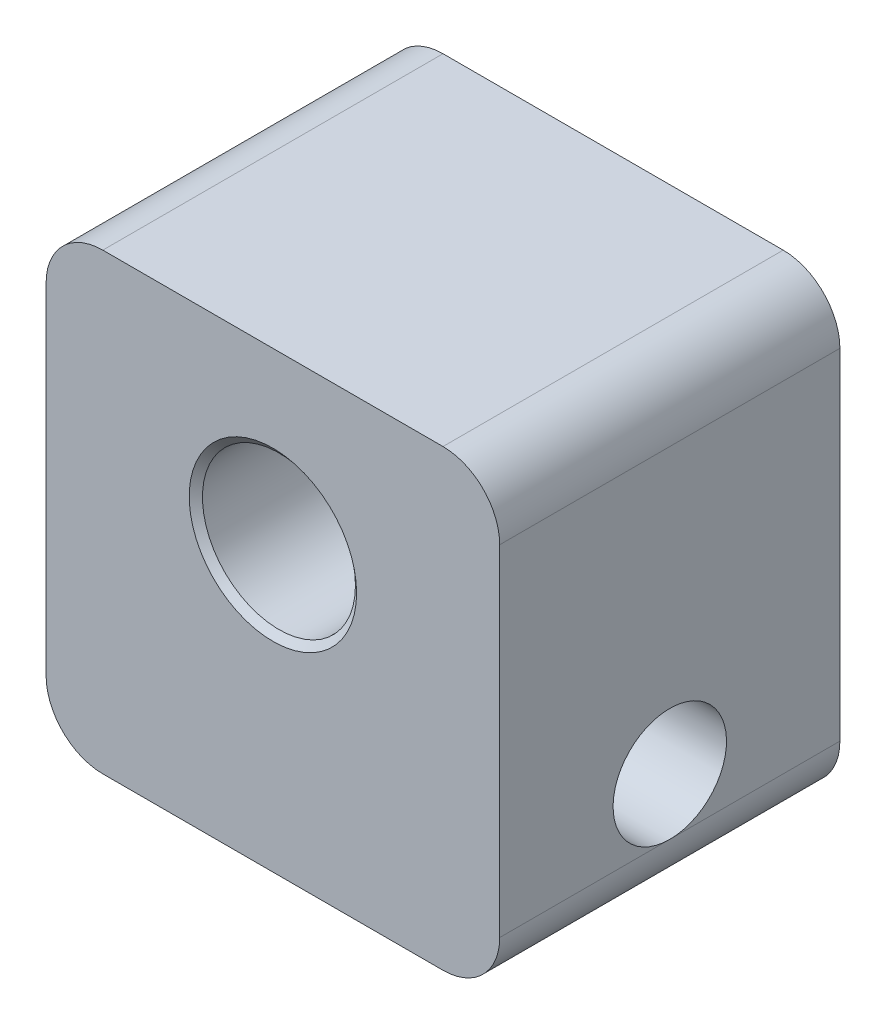
ISO-10303-21;
HEADER;
FILE_DESCRIPTION(('STEP AP214'),'2;1');
FILE_NAME('part.step','',(''),(''),'','','');
FILE_SCHEMA(('AUTOMOTIVE_DESIGN { 1 0 10303 214 1 1 1 1 }'));
ENDSEC;
DATA;
#1=APPLICATION_CONTEXT('core data for automotive mechanical design processes');
#2=APPLICATION_PROTOCOL_DEFINITION('international standard','automotive_design',2000,#1);
#3=PRODUCT_CONTEXT('',#1,'mechanical');
#4=PRODUCT('Part','Part','',(#3));
#5=PRODUCT_RELATED_PRODUCT_CATEGORY('part','',(#4));
#6=PRODUCT_DEFINITION_FORMATION('','',#4);
#7=PRODUCT_DEFINITION_CONTEXT('part definition',#1,'design');
#8=PRODUCT_DEFINITION('design','',#6,#7);
#9=PRODUCT_DEFINITION_SHAPE('','',#8);
#10=(LENGTH_UNIT() NAMED_UNIT(*) SI_UNIT(.MILLI.,.METRE.));
#11=(NAMED_UNIT(*) PLANE_ANGLE_UNIT() SI_UNIT($,.RADIAN.));
#12=(NAMED_UNIT(*) SI_UNIT($,.STERADIAN.) SOLID_ANGLE_UNIT());
#13=UNCERTAINTY_MEASURE_WITH_UNIT(LENGTH_MEASURE(1.E-05),#10,'distance_accuracy_value','');
#14=(GEOMETRIC_REPRESENTATION_CONTEXT(3) GLOBAL_UNCERTAINTY_ASSIGNED_CONTEXT((#13)) GLOBAL_UNIT_ASSIGNED_CONTEXT((#10,
#11,#12)) REPRESENTATION_CONTEXT('',''));
#15=CARTESIAN_POINT('',(0.,0.,0.));
#16=DIRECTION('',(0.,0.,1.));
#17=DIRECTION('',(1.,0.,0.));
#18=AXIS2_PLACEMENT_3D('',#15,#16,#17);
#19=CARTESIAN_POINT('',(20.,40.,-15.));
#20=DIRECTION('',(-1.,0.,0.));
#21=DIRECTION('',(0.,0.,1.));
#22=AXIS2_PLACEMENT_3D('',#19,#20,#21);
#23=PLANE('',#22);
#24=DIRECTION('',(0.,-1.,0.));
#25=VECTOR('',#24,1.);
#26=CARTESIAN_POINT('',(20.,40.,15.));
#27=LINE('',#26,#25);
#28=CARTESIAN_POINT('',(20.,35.,15.));
#29=VERTEX_POINT('',#28);
#30=CARTESIAN_POINT('',(20.,5.,15.));
#31=VERTEX_POINT('',#30);
#32=EDGE_CURVE('E134',#29,#31,#27,.T.);
#33=ORIENTED_EDGE('',*,*,#32,.T.);
#34=DIRECTION('',(0.,0.,-1.));
#35=VECTOR('',#34,1.);
#36=CARTESIAN_POINT('',(20.,5.,-15.));
#37=LINE('',#36,#35);
#38=CARTESIAN_POINT('',(20.,5.,0.));
#39=VERTEX_POINT('',#38);
#40=EDGE_CURVE('E120',#31,#39,#37,.T.);
#41=ORIENTED_EDGE('',*,*,#40,.T.);
#42=CARTESIAN_POINT('',(20.,10.,0.));
#43=DIRECTION('',(1.,0.,0.));
#44=DIRECTION('',(0.,0.,-1.));
#45=AXIS2_PLACEMENT_3D('',#42,#43,#44);
#46=CIRCLE('',#45,5.);
#47=EDGE_CURVE('E132',#39,#39,#46,.T.);
#48=ORIENTED_EDGE('',*,*,#47,.F.);
#49=DIRECTION('',(0.,0.,-1.));
#50=VECTOR('',#49,1.);
#51=CARTESIAN_POINT('',(20.,5.,-15.));
#52=LINE('',#51,#50);
#53=CARTESIAN_POINT('',(20.,5.,-15.));
#54=VERTEX_POINT('',#53);
#55=EDGE_CURVE('E116',#39,#54,#52,.T.);
#56=ORIENTED_EDGE('',*,*,#55,.T.);
#57=DIRECTION('',(0.,-1.,0.));
#58=VECTOR('',#57,1.);
#59=CARTESIAN_POINT('',(20.,40.,-15.));
#60=LINE('',#59,#58);
#61=CARTESIAN_POINT('',(20.,35.,-15.));
#62=VERTEX_POINT('',#61);
#63=EDGE_CURVE('E181',#62,#54,#60,.T.);
#64=ORIENTED_EDGE('',*,*,#63,.F.);
#65=DIRECTION('',(0.,0.,-1.));
#66=VECTOR('',#65,1.);
#67=CARTESIAN_POINT('',(20.,35.,15.));
#68=LINE('',#67,#66);
#69=EDGE_CURVE('E128',#62,#29,#68,.F.);
#70=ORIENTED_EDGE('',*,*,#69,.T.);
#71=EDGE_LOOP('',(#33,#41,#48,#56,#64,#70));
#72=FACE_BOUND('',#71,.T.);
#73=ADVANCED_FACE('F43',(#72),#23,.F.);
#74=CARTESIAN_POINT('',(-20.,40.,-15.));
#75=DIRECTION('',(0.,0.,1.));
#76=DIRECTION('',(1.,0.,0.));
#77=AXIS2_PLACEMENT_3D('',#74,#75,#76);
#78=PLANE('',#77);
#79=CARTESIAN_POINT('',(0.,25.,-15.));
#80=DIRECTION('',(0.,0.,1.));
#81=DIRECTION('',(1.,0.,0.));
#82=AXIS2_PLACEMENT_3D('',#79,#80,#81);
#83=CIRCLE('',#82,11.74624);
#84=CARTESIAN_POINT('',(11.74624,25.,-15.));
#85=VERTEX_POINT('',#84);
#86=EDGE_CURVE('E136',#85,#85,#83,.T.);
#87=ORIENTED_EDGE('',*,*,#86,.T.);
#88=EDGE_LOOP('',(#87));
#89=FACE_BOUND('',#88,.T.);
#90=ORIENTED_EDGE('',*,*,#63,.T.);
#91=CARTESIAN_POINT('',(15.,5.,-15.));
#92=DIRECTION('',(0.,0.,1.));
#93=DIRECTION('',(1.,0.,0.));
#94=AXIS2_PLACEMENT_3D('',#91,#92,#93);
#95=CIRCLE('',#94,5.);
#96=CARTESIAN_POINT('',(15.,0.,-15.));
#97=VERTEX_POINT('',#96);
#98=EDGE_CURVE('E122',#54,#97,#95,.F.);
#99=ORIENTED_EDGE('',*,*,#98,.T.);
#100=DIRECTION('',(-1.,0.,0.));
#101=VECTOR('',#100,1.);
#102=CARTESIAN_POINT('',(-20.,0.,-15.));
#103=LINE('',#102,#101);
#104=CARTESIAN_POINT('',(-15.,0.,-15.));
#105=VERTEX_POINT('',#104);
#106=EDGE_CURVE('E156',#97,#105,#103,.T.);
#107=ORIENTED_EDGE('',*,*,#106,.T.);
#108=CARTESIAN_POINT('',(-15.,5.,-15.));
#109=DIRECTION('',(0.,0.,1.));
#110=DIRECTION('',(1.,0.,0.));
#111=AXIS2_PLACEMENT_3D('',#108,#109,#110);
#112=CIRCLE('',#111,5.);
#113=CARTESIAN_POINT('',(-20.,5.,-15.));
#114=VERTEX_POINT('',#113);
#115=EDGE_CURVE('E195',#105,#114,#112,.F.);
#116=ORIENTED_EDGE('',*,*,#115,.T.);
#117=DIRECTION('',(0.,-1.,0.));
#118=VECTOR('',#117,1.);
#119=CARTESIAN_POINT('',(-20.,40.,-15.));
#120=LINE('',#119,#118);
#121=CARTESIAN_POINT('',(-20.,35.,-15.));
#122=VERTEX_POINT('',#121);
#123=EDGE_CURVE('E177',#122,#114,#120,.T.);
#124=ORIENTED_EDGE('',*,*,#123,.F.);
#125=CARTESIAN_POINT('',(-15.,35.,-15.));
#126=DIRECTION('',(0.,0.,1.));
#127=DIRECTION('',(1.,0.,0.));
#128=AXIS2_PLACEMENT_3D('',#125,#126,#127);
#129=CIRCLE('',#128,5.);
#130=CARTESIAN_POINT('',(-15.,40.,-15.));
#131=VERTEX_POINT('',#130);
#132=EDGE_CURVE('E192',#122,#131,#129,.F.);
#133=ORIENTED_EDGE('',*,*,#132,.T.);
#134=DIRECTION('',(-1.,0.,0.));
#135=VECTOR('',#134,1.);
#136=CARTESIAN_POINT('',(-20.,40.,-15.));
#137=LINE('',#136,#135);
#138=CARTESIAN_POINT('',(15.,40.,-15.));
#139=VERTEX_POINT('',#138);
#140=EDGE_CURVE('E157',#139,#131,#137,.T.);
#141=ORIENTED_EDGE('',*,*,#140,.F.);
#142=CARTESIAN_POINT('',(15.,35.,-15.));
#143=DIRECTION('',(0.,0.,1.));
#144=DIRECTION('',(1.,0.,0.));
#145=AXIS2_PLACEMENT_3D('',#142,#143,#144);
#146=CIRCLE('',#145,5.);
#147=EDGE_CURVE('E189',#139,#62,#146,.F.);
#148=ORIENTED_EDGE('',*,*,#147,.T.);
#149=EDGE_LOOP('',(#90,#99,#107,#116,#124,#133,#141,#148));
#150=FACE_BOUND('',#149,.T.);
#151=ADVANCED_FACE('F246',(#89,#150),#78,.F.);
#152=CARTESIAN_POINT('',(-20.,40.,-15.));
#153=DIRECTION('',(1.,0.,0.));
#154=DIRECTION('',(0.,0.,-1.));
#155=AXIS2_PLACEMENT_3D('',#152,#153,#154);
#156=PLANE('',#155);
#157=ORIENTED_EDGE('',*,*,#123,.T.);
#158=DIRECTION('',(0.,0.,1.));
#159=VECTOR('',#158,1.);
#160=CARTESIAN_POINT('',(-20.,5.,-15.));
#161=LINE('',#160,#159);
#162=CARTESIAN_POINT('',(-20.,5.,0.));
#163=VERTEX_POINT('',#162);
#164=EDGE_CURVE('E223',#114,#163,#161,.T.);
#165=ORIENTED_EDGE('',*,*,#164,.T.);
#166=CARTESIAN_POINT('',(-20.,10.,0.));
#167=DIRECTION('',(1.,0.,0.));
#168=DIRECTION('',(0.,0.,-1.));
#169=AXIS2_PLACEMENT_3D('',#166,#167,#168);
#170=CIRCLE('',#169,5.);
#171=EDGE_CURVE('E142',#163,#163,#170,.F.);
#172=ORIENTED_EDGE('',*,*,#171,.F.);
#173=DIRECTION('',(0.,0.,1.));
#174=VECTOR('',#173,1.);
#175=CARTESIAN_POINT('',(-20.,5.,-15.));
#176=LINE('',#175,#174);
#177=CARTESIAN_POINT('',(-20.,5.,15.));
#178=VERTEX_POINT('',#177);
#179=EDGE_CURVE('E59',#163,#178,#176,.T.);
#180=ORIENTED_EDGE('',*,*,#179,.T.);
#181=DIRECTION('',(0.,-1.,0.));
#182=VECTOR('',#181,1.);
#183=CARTESIAN_POINT('',(-20.,40.,15.));
#184=LINE('',#183,#182);
#185=CARTESIAN_POINT('',(-20.,35.,15.));
#186=VERTEX_POINT('',#185);
#187=EDGE_CURVE('E174',#186,#178,#184,.T.);
#188=ORIENTED_EDGE('',*,*,#187,.F.);
#189=DIRECTION('',(0.,0.,1.));
#190=VECTOR('',#189,1.);
#191=CARTESIAN_POINT('',(-20.,35.,-15.));
#192=LINE('',#191,#190);
#193=EDGE_CURVE('E218',#186,#122,#192,.F.);
#194=ORIENTED_EDGE('',*,*,#193,.T.);
#195=EDGE_LOOP('',(#157,#165,#172,#180,#188,#194));
#196=FACE_BOUND('',#195,.T.);
#197=ADVANCED_FACE('F250',(#196),#156,.F.);
#198=CARTESIAN_POINT('',(-20.,40.,15.));
#199=DIRECTION('',(0.,0.,-1.));
#200=DIRECTION('',(-1.,0.,0.));
#201=AXIS2_PLACEMENT_3D('',#198,#199,#200);
#202=PLANE('',#201);
#203=CARTESIAN_POINT('',(0.,25.,15.));
#204=DIRECTION('',(0.,0.,1.));
#205=DIRECTION('',(1.,0.,0.));
#206=AXIS2_PLACEMENT_3D('',#203,#204,#205);
#207=CIRCLE('',#206,7.38124);
#208=CARTESIAN_POINT('',(7.38124,25.,15.));
#209=VERTEX_POINT('',#208);
#210=EDGE_CURVE('E146',#209,#209,#207,.T.);
#211=ORIENTED_EDGE('',*,*,#210,.F.);
#212=EDGE_LOOP('',(#211));
#213=FACE_BOUND('',#212,.T.);
#214=DIRECTION('',(1.,0.,0.));
#215=VECTOR('',#214,1.);
#216=CARTESIAN_POINT('',(-20.,0.,15.));
#217=LINE('',#216,#215);
#218=CARTESIAN_POINT('',(-15.,0.,15.));
#219=VERTEX_POINT('',#218);
#220=CARTESIAN_POINT('',(15.,0.,15.));
#221=VERTEX_POINT('',#220);
#222=EDGE_CURVE('E162',#219,#221,#217,.T.);
#223=ORIENTED_EDGE('',*,*,#222,.T.);
#224=CARTESIAN_POINT('',(15.,5.,15.));
#225=DIRECTION('',(0.,0.,-1.));
#226=DIRECTION('',(-1.,0.,0.));
#227=AXIS2_PLACEMENT_3D('',#224,#225,#226);
#228=CIRCLE('',#227,5.);
#229=EDGE_CURVE('E215',#221,#31,#228,.F.);
#230=ORIENTED_EDGE('',*,*,#229,.T.);
#231=ORIENTED_EDGE('',*,*,#32,.F.);
#232=CARTESIAN_POINT('',(15.,35.,15.));
#233=DIRECTION('',(0.,0.,-1.));
#234=DIRECTION('',(-1.,0.,0.));
#235=AXIS2_PLACEMENT_3D('',#232,#233,#234);
#236=CIRCLE('',#235,5.);
#237=CARTESIAN_POINT('',(15.,40.,15.));
#238=VERTEX_POINT('',#237);
#239=EDGE_CURVE('E206',#29,#238,#236,.F.);
#240=ORIENTED_EDGE('',*,*,#239,.T.);
#241=DIRECTION('',(1.,0.,0.));
#242=VECTOR('',#241,1.);
#243=CARTESIAN_POINT('',(-20.,40.,15.));
#244=LINE('',#243,#242);
#245=CARTESIAN_POINT('',(-15.,40.,15.));
#246=VERTEX_POINT('',#245);
#247=EDGE_CURVE('E161',#246,#238,#244,.T.);
#248=ORIENTED_EDGE('',*,*,#247,.F.);
#249=CARTESIAN_POINT('',(-15.,35.,15.));
#250=DIRECTION('',(0.,0.,-1.));
#251=DIRECTION('',(-1.,0.,0.));
#252=AXIS2_PLACEMENT_3D('',#249,#250,#251);
#253=CIRCLE('',#252,5.);
#254=EDGE_CURVE('E209',#246,#186,#253,.F.);
#255=ORIENTED_EDGE('',*,*,#254,.T.);
#256=ORIENTED_EDGE('',*,*,#187,.T.);
#257=CARTESIAN_POINT('',(-15.,5.,15.));
#258=DIRECTION('',(0.,0.,-1.));
#259=DIRECTION('',(-1.,0.,0.));
#260=AXIS2_PLACEMENT_3D('',#257,#258,#259);
#261=CIRCLE('',#260,5.);
#262=EDGE_CURVE('E212',#178,#219,#261,.F.);
#263=ORIENTED_EDGE('',*,*,#262,.T.);
#264=EDGE_LOOP('',(#223,#230,#231,#240,#248,#255,#256,#263));
#265=FACE_BOUND('',#264,.T.);
#266=ADVANCED_FACE('F240',(#213,#265),#202,.F.);
#267=CARTESIAN_POINT('',(0.,40.,0.));
#268=DIRECTION('',(0.,1.,0.));
#269=DIRECTION('',(0.,0.,1.));
#270=AXIS2_PLACEMENT_3D('',#267,#268,#269);
#271=PLANE('',#270);
#272=ORIENTED_EDGE('',*,*,#140,.T.);
#273=DIRECTION('',(0.,0.,1.));
#274=VECTOR('',#273,1.);
#275=CARTESIAN_POINT('',(-15.,40.,15.));
#276=LINE('',#275,#274);
#277=EDGE_CURVE('E52',#131,#246,#276,.T.);
#278=ORIENTED_EDGE('',*,*,#277,.T.);
#279=ORIENTED_EDGE('',*,*,#247,.T.);
#280=DIRECTION('',(0.,0.,-1.));
#281=VECTOR('',#280,1.);
#282=CARTESIAN_POINT('',(15.,40.,-15.));
#283=LINE('',#282,#281);
#284=EDGE_CURVE('E226',#238,#139,#283,.T.);
#285=ORIENTED_EDGE('',*,*,#284,.T.);
#286=EDGE_LOOP('',(#272,#278,#279,#285));
#287=FACE_BOUND('',#286,.T.);
#288=ADVANCED_FACE('F234',(#287),#271,.T.);
#289=CARTESIAN_POINT('',(0.,0.,0.));
#290=DIRECTION('',(0.,1.,0.));
#291=DIRECTION('',(0.,0.,1.));
#292=AXIS2_PLACEMENT_3D('',#289,#290,#291);
#293=PLANE('',#292);
#294=ORIENTED_EDGE('',*,*,#106,.F.);
#295=DIRECTION('',(0.,0.,-1.));
#296=VECTOR('',#295,1.);
#297=CARTESIAN_POINT('',(15.,0.,0.));
#298=LINE('',#297,#296);
#299=EDGE_CURVE('E203',#97,#221,#298,.F.);
#300=ORIENTED_EDGE('',*,*,#299,.T.);
#301=ORIENTED_EDGE('',*,*,#222,.F.);
#302=DIRECTION('',(0.,0.,1.));
#303=VECTOR('',#302,1.);
#304=CARTESIAN_POINT('',(-15.,0.,0.));
#305=LINE('',#304,#303);
#306=EDGE_CURVE('E200',#219,#105,#305,.F.);
#307=ORIENTED_EDGE('',*,*,#306,.T.);
#308=EDGE_LOOP('',(#294,#300,#301,#307));
#309=FACE_BOUND('',#308,.T.);
#310=ADVANCED_FACE('F257',(#309),#293,.F.);
#311=CARTESIAN_POINT('',(0.,25.,15.));
#312=DIRECTION('',(0.,0.,1.));
#313=DIRECTION('',(1.,0.,0.));
#314=AXIS2_PLACEMENT_3D('',#311,#312,#313);
#315=CYLINDRICAL_SURFACE('',#314,6.74624);
#316=CARTESIAN_POINT('',(0.,25.,-10.));
#317=DIRECTION('',(0.,0.,1.));
#318=DIRECTION('',(1.,0.,0.));
#319=AXIS2_PLACEMENT_3D('',#316,#317,#318);
#320=CIRCLE('',#319,6.74624);
#321=CARTESIAN_POINT('',(6.74624,25.,-10.));
#322=VERTEX_POINT('',#321);
#323=EDGE_CURVE('E11',#322,#322,#320,.F.);
#324=ORIENTED_EDGE('',*,*,#323,.T.);
#325=EDGE_LOOP('',(#324));
#326=FACE_BOUND('',#325,.T.);
#327=CARTESIAN_POINT('',(0.,25.,14.4671717342024));
#328=DIRECTION('',(0.,0.,1.));
#329=DIRECTION('',(1.,0.,0.));
#330=AXIS2_PLACEMENT_3D('',#327,#328,#329);
#331=CIRCLE('',#330,6.74624);
#332=CARTESIAN_POINT('',(6.74624,25.,14.4671717342024));
#333=VERTEX_POINT('',#332);
#334=EDGE_CURVE('E152',#333,#333,#331,.T.);
#335=ORIENTED_EDGE('',*,*,#334,.T.);
#336=EDGE_LOOP('',(#335));
#337=FACE_BOUND('',#336,.T.);
#338=ADVANCED_FACE('F259',(#326,#337),#315,.F.);
#339=CARTESIAN_POINT('',(0.,25.,15.));
#340=DIRECTION('',(0.,0.,1.));
#341=DIRECTION('',(1.,0.,0.));
#342=AXIS2_PLACEMENT_3D('',#339,#340,#341);
#343=CONICAL_SURFACE('',#342,7.38124,0.87266462599716);
#344=ORIENTED_EDGE('',*,*,#334,.F.);
#345=EDGE_LOOP('',(#344));
#346=FACE_BOUND('',#345,.T.);
#347=ORIENTED_EDGE('',*,*,#210,.T.);
#348=EDGE_LOOP('',(#347));
#349=FACE_BOUND('',#348,.T.);
#350=ADVANCED_FACE('F265',(#346,#349),#343,.F.);
#351=CARTESIAN_POINT('',(-20.001,10.,0.));
#352=DIRECTION('',(1.,0.,0.));
#353=DIRECTION('',(0.,0.,-1.));
#354=AXIS2_PLACEMENT_3D('',#351,#352,#353);
#355=CYLINDRICAL_SURFACE('',#354,5.);
#356=ORIENTED_EDGE('',*,*,#47,.T.);
#357=EDGE_LOOP('',(#356));
#358=FACE_BOUND('',#357,.T.);
#359=ORIENTED_EDGE('',*,*,#171,.T.);
#360=EDGE_LOOP('',(#359));
#361=FACE_BOUND('',#360,.T.);
#362=ADVANCED_FACE('F139',(#358,#361),#355,.F.);
#363=CARTESIAN_POINT('',(15.,5.,-15.));
#364=DIRECTION('',(0.,0.,-1.));
#365=DIRECTION('',(-1.,0.,0.));
#366=AXIS2_PLACEMENT_3D('',#363,#364,#365);
#367=CYLINDRICAL_SURFACE('',#366,5.);
#368=ORIENTED_EDGE('',*,*,#229,.F.);
#369=ORIENTED_EDGE('',*,*,#299,.F.);
#370=ORIENTED_EDGE('',*,*,#98,.F.);
#371=ORIENTED_EDGE('',*,*,#55,.F.);
#372=ORIENTED_EDGE('',*,*,#40,.F.);
#373=EDGE_LOOP('',(#368,#369,#370,#371,#372));
#374=FACE_BOUND('',#373,.T.);
#375=ADVANCED_FACE('F119',(#374),#367,.T.);
#376=CARTESIAN_POINT('',(-15.,5.,-15.));
#377=DIRECTION('',(0.,0.,1.));
#378=DIRECTION('',(1.,0.,0.));
#379=AXIS2_PLACEMENT_3D('',#376,#377,#378);
#380=CYLINDRICAL_SURFACE('',#379,5.);
#381=ORIENTED_EDGE('',*,*,#115,.F.);
#382=ORIENTED_EDGE('',*,*,#306,.F.);
#383=ORIENTED_EDGE('',*,*,#262,.F.);
#384=ORIENTED_EDGE('',*,*,#179,.F.);
#385=ORIENTED_EDGE('',*,*,#164,.F.);
#386=EDGE_LOOP('',(#381,#382,#383,#384,#385));
#387=FACE_BOUND('',#386,.T.);
#388=ADVANCED_FACE('F254',(#387),#380,.T.);
#389=CARTESIAN_POINT('',(-15.,35.,0.));
#390=DIRECTION('',(0.,0.,-1.));
#391=DIRECTION('',(-1.,0.,0.));
#392=AXIS2_PLACEMENT_3D('',#389,#390,#391);
#393=CYLINDRICAL_SURFACE('',#392,5.);
#394=ORIENTED_EDGE('',*,*,#132,.F.);
#395=ORIENTED_EDGE('',*,*,#193,.F.);
#396=ORIENTED_EDGE('',*,*,#254,.F.);
#397=ORIENTED_EDGE('',*,*,#277,.F.);
#398=EDGE_LOOP('',(#394,#395,#396,#397));
#399=FACE_BOUND('',#398,.T.);
#400=ADVANCED_FACE('F249',(#399),#393,.T.);
#401=CARTESIAN_POINT('',(15.,35.,0.));
#402=DIRECTION('',(0.,0.,1.));
#403=DIRECTION('',(1.,0.,0.));
#404=AXIS2_PLACEMENT_3D('',#401,#402,#403);
#405=CYLINDRICAL_SURFACE('',#404,5.);
#406=ORIENTED_EDGE('',*,*,#239,.F.);
#407=ORIENTED_EDGE('',*,*,#69,.F.);
#408=ORIENTED_EDGE('',*,*,#147,.F.);
#409=ORIENTED_EDGE('',*,*,#284,.F.);
#410=EDGE_LOOP('',(#406,#407,#408,#409));
#411=FACE_BOUND('',#410,.T.);
#412=ADVANCED_FACE('F244',(#411),#405,.T.);
#413=CARTESIAN_POINT('',(0.,25.,-10.));
#414=DIRECTION('',(0.,0.,1.));
#415=DIRECTION('',(1.,0.,0.));
#416=AXIS2_PLACEMENT_3D('',#413,#414,#415);
#417=TOROIDAL_SURFACE('',#416,11.74624,5.);
#418=ORIENTED_EDGE('',*,*,#323,.F.);
#419=EDGE_LOOP('',(#418));
#420=FACE_BOUND('',#419,.T.);
#421=ORIENTED_EDGE('',*,*,#86,.F.);
#422=EDGE_LOOP('',(#421));
#423=FACE_BOUND('',#422,.T.);
#424=ADVANCED_FACE('F45',(#420,#423),#417,.T.);
#425=CLOSED_SHELL('',(#73,#151,#197,#266,#288,#310,#338,#350,#362,#375,#388,#400,#412,#424));
#426=MANIFOLD_SOLID_BREP('B2',#425);
#427=ADVANCED_BREP_SHAPE_REPRESENTATION('',(#18,#426),#14);
#428=SHAPE_DEFINITION_REPRESENTATION(#9,#427);
ENDSEC;
END-ISO-10303-21;
